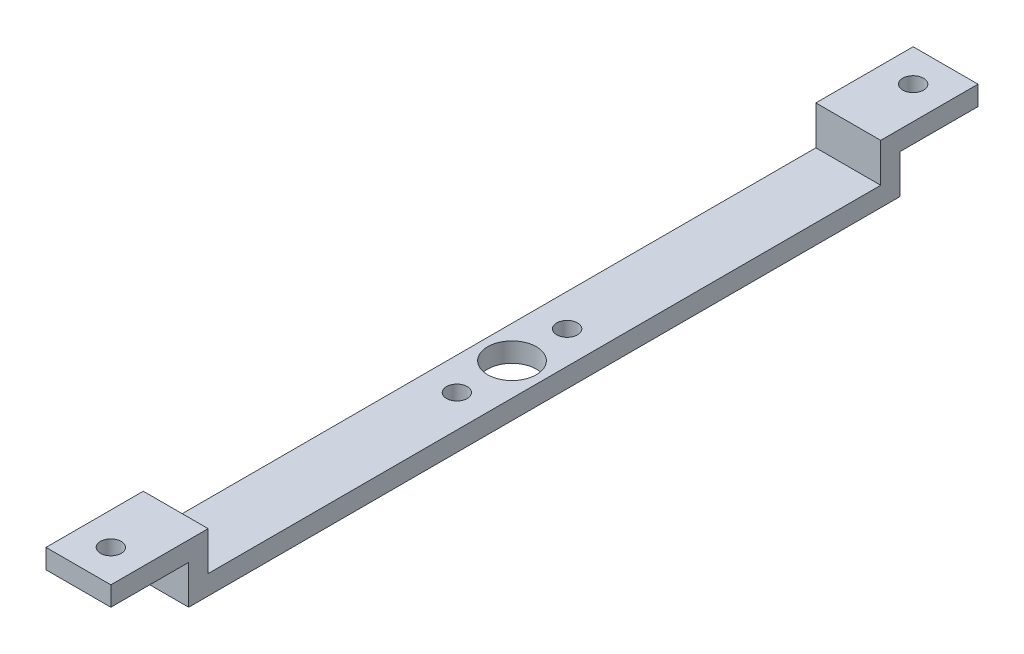
ISO-10303-21;
HEADER;
FILE_DESCRIPTION(('STEP AP214'),'2;1');
FILE_NAME('part.step','',(''),(''),'','','');
FILE_SCHEMA(('AUTOMOTIVE_DESIGN { 1 0 10303 214 1 1 1 1 }'));
ENDSEC;
DATA;
#1=APPLICATION_CONTEXT('core data for automotive mechanical design processes');
#2=APPLICATION_PROTOCOL_DEFINITION('international standard','automotive_design',2000,#1);
#3=PRODUCT_CONTEXT('',#1,'mechanical');
#4=PRODUCT('Part','Part','',(#3));
#5=PRODUCT_RELATED_PRODUCT_CATEGORY('part','',(#4));
#6=PRODUCT_DEFINITION_FORMATION('','',#4);
#7=PRODUCT_DEFINITION_CONTEXT('part definition',#1,'design');
#8=PRODUCT_DEFINITION('design','',#6,#7);
#9=PRODUCT_DEFINITION_SHAPE('','',#8);
#10=(LENGTH_UNIT() NAMED_UNIT(*) SI_UNIT(.MILLI.,.METRE.));
#11=(NAMED_UNIT(*) PLANE_ANGLE_UNIT() SI_UNIT($,.RADIAN.));
#12=(NAMED_UNIT(*) SI_UNIT($,.STERADIAN.) SOLID_ANGLE_UNIT());
#13=UNCERTAINTY_MEASURE_WITH_UNIT(LENGTH_MEASURE(1.E-05),#10,'distance_accuracy_value','');
#14=(GEOMETRIC_REPRESENTATION_CONTEXT(3) GLOBAL_UNCERTAINTY_ASSIGNED_CONTEXT((#13)) GLOBAL_UNIT_ASSIGNED_CONTEXT((#10,
#11,#12)) REPRESENTATION_CONTEXT('',''));
#15=CARTESIAN_POINT('',(0.,0.,0.));
#16=DIRECTION('',(0.,0.,1.));
#17=DIRECTION('',(1.,0.,0.));
#18=AXIS2_PLACEMENT_3D('',#15,#16,#17);
#19=CARTESIAN_POINT('',(10.,0.,61.85));
#20=DIRECTION('',(0.,-1.,0.));
#21=DIRECTION('',(0.,0.,-1.));
#22=AXIS2_PLACEMENT_3D('',#19,#20,#21);
#23=PLANE('',#22);
#24=CARTESIAN_POINT('',(5.,0.,61.85));
#25=DIRECTION('',(0.,-1.,0.));
#26=DIRECTION('',(0.,0.,-1.));
#27=AXIS2_PLACEMENT_3D('',#24,#25,#26);
#28=CIRCLE('',#27,1.6);
#29=CARTESIAN_POINT('',(5.,0.,60.25));
#30=VERTEX_POINT('',#29);
#31=EDGE_CURVE('E262',#30,#30,#28,.F.);
#32=ORIENTED_EDGE('',*,*,#31,.F.);
#33=EDGE_LOOP('',(#32));
#34=FACE_BOUND('',#33,.T.);
#35=DIRECTION('',(0.,0.,1.));
#36=VECTOR('',#35,1.);
#37=CARTESIAN_POINT('',(0.,0.,61.85));
#38=LINE('',#37,#36);
#39=CARTESIAN_POINT('',(0.,0.,51.85));
#40=VERTEX_POINT('',#39);
#41=CARTESIAN_POINT('',(0.,0.,66.85));
#42=VERTEX_POINT('',#41);
#43=EDGE_CURVE('E112',#40,#42,#38,.T.);
#44=ORIENTED_EDGE('',*,*,#43,.T.);
#45=DIRECTION('',(-1.,0.,0.));
#46=VECTOR('',#45,1.);
#47=CARTESIAN_POINT('',(10.,0.,66.85));
#48=LINE('',#47,#46);
#49=CARTESIAN_POINT('',(10.,0.,66.85));
#50=VERTEX_POINT('',#49);
#51=EDGE_CURVE('E11',#50,#42,#48,.T.);
#52=ORIENTED_EDGE('',*,*,#51,.F.);
#53=DIRECTION('',(0.,0.,1.));
#54=VECTOR('',#53,1.);
#55=CARTESIAN_POINT('',(10.,0.,61.85));
#56=LINE('',#55,#54);
#57=CARTESIAN_POINT('',(10.,0.,51.85));
#58=VERTEX_POINT('',#57);
#59=EDGE_CURVE('E118',#58,#50,#56,.T.);
#60=ORIENTED_EDGE('',*,*,#59,.F.);
#61=DIRECTION('',(-1.,0.,0.));
#62=VECTOR('',#61,1.);
#63=CARTESIAN_POINT('',(10.,0.,51.85));
#64=LINE('',#63,#62);
#65=EDGE_CURVE('E168',#58,#40,#64,.T.);
#66=ORIENTED_EDGE('',*,*,#65,.T.);
#67=EDGE_LOOP('',(#44,#52,#60,#66));
#68=FACE_BOUND('',#67,.T.);
#69=ADVANCED_FACE('F45',(#34,#68),#23,.F.);
#70=CARTESIAN_POINT('',(10.,0.,66.85));
#71=DIRECTION('',(0.,0.,-1.));
#72=DIRECTION('',(-1.,0.,0.));
#73=AXIS2_PLACEMENT_3D('',#70,#71,#72);
#74=PLANE('',#73);
#75=DIRECTION('',(0.,-1.,0.));
#76=VECTOR('',#75,1.);
#77=CARTESIAN_POINT('',(0.,0.,66.85));
#78=LINE('',#77,#76);
#79=CARTESIAN_POINT('',(0.,-3.,66.85));
#80=VERTEX_POINT('',#79);
#81=EDGE_CURVE('E174',#42,#80,#78,.T.);
#82=ORIENTED_EDGE('',*,*,#81,.T.);
#83=DIRECTION('',(-1.,0.,0.));
#84=VECTOR('',#83,1.);
#85=CARTESIAN_POINT('',(10.,-3.,66.85));
#86=LINE('',#85,#84);
#87=CARTESIAN_POINT('',(10.,-3.,66.85));
#88=VERTEX_POINT('',#87);
#89=EDGE_CURVE('E55',#88,#80,#86,.T.);
#90=ORIENTED_EDGE('',*,*,#89,.F.);
#91=DIRECTION('',(0.,-1.,0.));
#92=VECTOR('',#91,1.);
#93=CARTESIAN_POINT('',(10.,0.,66.85));
#94=LINE('',#93,#92);
#95=EDGE_CURVE('E283',#50,#88,#94,.T.);
#96=ORIENTED_EDGE('',*,*,#95,.F.);
#97=ORIENTED_EDGE('',*,*,#51,.T.);
#98=EDGE_LOOP('',(#82,#90,#96,#97));
#99=FACE_BOUND('',#98,.T.);
#100=ADVANCED_FACE('F315',(#99),#74,.F.);
#101=CARTESIAN_POINT('',(10.,-3.,66.85));
#102=DIRECTION('',(0.,1.,0.));
#103=DIRECTION('',(0.,0.,1.));
#104=AXIS2_PLACEMENT_3D('',#101,#102,#103);
#105=PLANE('',#104);
#106=CARTESIAN_POINT('',(5.,-3.,61.85));
#107=DIRECTION('',(0.,1.,0.));
#108=DIRECTION('',(0.,0.,1.));
#109=AXIS2_PLACEMENT_3D('',#106,#107,#108);
#110=CIRCLE('',#109,1.6);
#111=CARTESIAN_POINT('',(5.,-3.,63.45));
#112=VERTEX_POINT('',#111);
#113=EDGE_CURVE('E48',#112,#112,#110,.F.);
#114=ORIENTED_EDGE('',*,*,#113,.F.);
#115=EDGE_LOOP('',(#114));
#116=FACE_BOUND('',#115,.T.);
#117=DIRECTION('',(0.,0.,-1.));
#118=VECTOR('',#117,1.);
#119=CARTESIAN_POINT('',(0.,-3.,66.85));
#120=LINE('',#119,#118);
#121=CARTESIAN_POINT('',(0.,-3.,54.85));
#122=VERTEX_POINT('',#121);
#123=EDGE_CURVE('E178',#80,#122,#120,.T.);
#124=ORIENTED_EDGE('',*,*,#123,.T.);
#125=DIRECTION('',(-1.,0.,0.));
#126=VECTOR('',#125,1.);
#127=CARTESIAN_POINT('',(10.,-3.,54.85));
#128=LINE('',#127,#126);
#129=CARTESIAN_POINT('',(10.,-3.,54.85));
#130=VERTEX_POINT('',#129);
#131=EDGE_CURVE('E236',#130,#122,#128,.T.);
#132=ORIENTED_EDGE('',*,*,#131,.F.);
#133=DIRECTION('',(0.,0.,-1.));
#134=VECTOR('',#133,1.);
#135=CARTESIAN_POINT('',(10.,-3.,66.85));
#136=LINE('',#135,#134);
#137=EDGE_CURVE('E286',#88,#130,#136,.T.);
#138=ORIENTED_EDGE('',*,*,#137,.F.);
#139=ORIENTED_EDGE('',*,*,#89,.T.);
#140=EDGE_LOOP('',(#124,#132,#138,#139));
#141=FACE_BOUND('',#140,.T.);
#142=ADVANCED_FACE('F311',(#116,#141),#105,.F.);
#143=CARTESIAN_POINT('',(10.,-6.00000000000001,54.85));
#144=DIRECTION('',(0.,0.,-1.));
#145=DIRECTION('',(-1.,0.,0.));
#146=AXIS2_PLACEMENT_3D('',#143,#144,#145);
#147=PLANE('',#146);
#148=DIRECTION('',(0.,-1.,0.));
#149=VECTOR('',#148,1.);
#150=CARTESIAN_POINT('',(0.,-6.00000000000001,54.85));
#151=LINE('',#150,#149);
#152=CARTESIAN_POINT('',(0.,-9.00000000000001,54.85));
#153=VERTEX_POINT('',#152);
#154=EDGE_CURVE('E182',#122,#153,#151,.T.);
#155=ORIENTED_EDGE('',*,*,#154,.T.);
#156=DIRECTION('',(-1.,0.,0.));
#157=VECTOR('',#156,1.);
#158=CARTESIAN_POINT('',(10.,-9.00000000000001,54.85));
#159=LINE('',#158,#157);
#160=CARTESIAN_POINT('',(10.,-9.00000000000001,54.85));
#161=VERTEX_POINT('',#160);
#162=EDGE_CURVE('E232',#161,#153,#159,.T.);
#163=ORIENTED_EDGE('',*,*,#162,.F.);
#164=DIRECTION('',(0.,-1.,0.));
#165=VECTOR('',#164,1.);
#166=CARTESIAN_POINT('',(10.,-3.,54.85));
#167=LINE('',#166,#165);
#168=EDGE_CURVE('E289',#130,#161,#167,.T.);
#169=ORIENTED_EDGE('',*,*,#168,.F.);
#170=ORIENTED_EDGE('',*,*,#131,.T.);
#171=EDGE_LOOP('',(#155,#163,#169,#170));
#172=FACE_BOUND('',#171,.T.);
#173=ADVANCED_FACE('F314',(#172),#147,.F.);
#174=CARTESIAN_POINT('',(10.,-9.00000000000001,54.85));
#175=DIRECTION('',(0.,1.,0.));
#176=DIRECTION('',(0.,0.,1.));
#177=AXIS2_PLACEMENT_3D('',#174,#175,#176);
#178=PLANE('',#177);
#179=CARTESIAN_POINT('',(5.00000000000001,-9.00000000000001,0.));
#180=DIRECTION('',(0.,1.,0.));
#181=DIRECTION('',(0.,0.,1.));
#182=AXIS2_PLACEMENT_3D('',#179,#180,#181);
#183=CIRCLE('',#182,3.75);
#184=CARTESIAN_POINT('',(5.00000000000001,-9.00000000000001,3.75));
#185=VERTEX_POINT('',#184);
#186=EDGE_CURVE('E246',#185,#185,#183,.T.);
#187=ORIENTED_EDGE('',*,*,#186,.T.);
#188=EDGE_LOOP('',(#187));
#189=FACE_BOUND('',#188,.T.);
#190=CARTESIAN_POINT('',(5.00000000000001,-9.00000000000001,-8.5));
#191=DIRECTION('',(0.,1.,0.));
#192=DIRECTION('',(0.,0.,1.));
#193=AXIS2_PLACEMENT_3D('',#190,#191,#192);
#194=CIRCLE('',#193,1.6);
#195=CARTESIAN_POINT('',(5.00000000000001,-9.00000000000001,-6.9));
#196=VERTEX_POINT('',#195);
#197=EDGE_CURVE('E175',#196,#196,#194,.T.);
#198=ORIENTED_EDGE('',*,*,#197,.T.);
#199=EDGE_LOOP('',(#198));
#200=FACE_BOUND('',#199,.T.);
#201=CARTESIAN_POINT('',(5.00000000000001,-9.00000000000001,8.5));
#202=DIRECTION('',(0.,1.,0.));
#203=DIRECTION('',(0.,0.,1.));
#204=AXIS2_PLACEMENT_3D('',#201,#202,#203);
#205=CIRCLE('',#204,1.6);
#206=CARTESIAN_POINT('',(5.00000000000001,-9.00000000000001,10.1));
#207=VERTEX_POINT('',#206);
#208=EDGE_CURVE('E274',#207,#207,#205,.T.);
#209=ORIENTED_EDGE('',*,*,#208,.T.);
#210=EDGE_LOOP('',(#209));
#211=FACE_BOUND('',#210,.T.);
#212=DIRECTION('',(0.,0.,-1.));
#213=VECTOR('',#212,1.);
#214=CARTESIAN_POINT('',(0.,-9.00000000000001,54.85));
#215=LINE('',#214,#213);
#216=CARTESIAN_POINT('',(0.,-9.00000000000001,-54.85));
#217=VERTEX_POINT('',#216);
#218=EDGE_CURVE('E185',#153,#217,#215,.T.);
#219=ORIENTED_EDGE('',*,*,#218,.T.);
#220=DIRECTION('',(-1.,0.,0.));
#221=VECTOR('',#220,1.);
#222=CARTESIAN_POINT('',(10.,-9.00000000000001,-54.85));
#223=LINE('',#222,#221);
#224=CARTESIAN_POINT('',(10.,-9.00000000000001,-54.85));
#225=VERTEX_POINT('',#224);
#226=EDGE_CURVE('E228',#225,#217,#223,.T.);
#227=ORIENTED_EDGE('',*,*,#226,.F.);
#228=DIRECTION('',(0.,0.,-1.));
#229=VECTOR('',#228,1.);
#230=CARTESIAN_POINT('',(10.,-9.00000000000001,54.85));
#231=LINE('',#230,#229);
#232=EDGE_CURVE('E292',#161,#225,#231,.T.);
#233=ORIENTED_EDGE('',*,*,#232,.F.);
#234=ORIENTED_EDGE('',*,*,#162,.T.);
#235=EDGE_LOOP('',(#219,#227,#233,#234));
#236=FACE_BOUND('',#235,.T.);
#237=ADVANCED_FACE('F379',(#189,#200,#211,#236),#178,.F.);
#238=CARTESIAN_POINT('',(10.,-3.,-54.85));
#239=DIRECTION('',(0.,0.,1.));
#240=DIRECTION('',(1.,0.,0.));
#241=AXIS2_PLACEMENT_3D('',#238,#239,#240);
#242=PLANE('',#241);
#243=DIRECTION('',(0.,1.,0.));
#244=VECTOR('',#243,1.);
#245=CARTESIAN_POINT('',(0.,-3.,-54.85));
#246=LINE('',#245,#244);
#247=CARTESIAN_POINT('',(0.,-3.,-54.85));
#248=VERTEX_POINT('',#247);
#249=EDGE_CURVE('E189',#217,#248,#246,.T.);
#250=ORIENTED_EDGE('',*,*,#249,.T.);
#251=DIRECTION('',(-1.,0.,0.));
#252=VECTOR('',#251,1.);
#253=CARTESIAN_POINT('',(10.,-3.,-54.85));
#254=LINE('',#253,#252);
#255=CARTESIAN_POINT('',(10.,-3.,-54.85));
#256=VERTEX_POINT('',#255);
#257=EDGE_CURVE('E224',#256,#248,#254,.T.);
#258=ORIENTED_EDGE('',*,*,#257,.F.);
#259=DIRECTION('',(0.,1.,0.));
#260=VECTOR('',#259,1.);
#261=CARTESIAN_POINT('',(10.,-6.00000000000001,-54.85));
#262=LINE('',#261,#260);
#263=EDGE_CURVE('E295',#225,#256,#262,.T.);
#264=ORIENTED_EDGE('',*,*,#263,.F.);
#265=ORIENTED_EDGE('',*,*,#226,.T.);
#266=EDGE_LOOP('',(#250,#258,#264,#265));
#267=FACE_BOUND('',#266,.T.);
#268=ADVANCED_FACE('F375',(#267),#242,.F.);
#269=CARTESIAN_POINT('',(10.,-3.,-66.85));
#270=DIRECTION('',(0.,1.,0.));
#271=DIRECTION('',(0.,0.,1.));
#272=AXIS2_PLACEMENT_3D('',#269,#270,#271);
#273=PLANE('',#272);
#274=CARTESIAN_POINT('',(5.,-3.,-61.85));
#275=DIRECTION('',(0.,1.,0.));
#276=DIRECTION('',(0.,0.,1.));
#277=AXIS2_PLACEMENT_3D('',#274,#275,#276);
#278=CIRCLE('',#277,1.6);
#279=CARTESIAN_POINT('',(5.,-3.,-60.25));
#280=VERTEX_POINT('',#279);
#281=EDGE_CURVE('E245',#280,#280,#278,.F.);
#282=ORIENTED_EDGE('',*,*,#281,.F.);
#283=EDGE_LOOP('',(#282));
#284=FACE_BOUND('',#283,.T.);
#285=DIRECTION('',(0.,0.,-1.));
#286=VECTOR('',#285,1.);
#287=CARTESIAN_POINT('',(0.,-3.,-66.85));
#288=LINE('',#287,#286);
#289=CARTESIAN_POINT('',(0.,-3.,-66.85));
#290=VERTEX_POINT('',#289);
#291=EDGE_CURVE('E192',#248,#290,#288,.T.);
#292=ORIENTED_EDGE('',*,*,#291,.T.);
#293=DIRECTION('',(-1.,0.,0.));
#294=VECTOR('',#293,1.);
#295=CARTESIAN_POINT('',(10.,-3.,-66.85));
#296=LINE('',#295,#294);
#297=CARTESIAN_POINT('',(10.,-3.,-66.85));
#298=VERTEX_POINT('',#297);
#299=EDGE_CURVE('E220',#298,#290,#296,.T.);
#300=ORIENTED_EDGE('',*,*,#299,.F.);
#301=DIRECTION('',(0.,0.,-1.));
#302=VECTOR('',#301,1.);
#303=CARTESIAN_POINT('',(10.,-3.,-66.85));
#304=LINE('',#303,#302);
#305=EDGE_CURVE('E298',#256,#298,#304,.T.);
#306=ORIENTED_EDGE('',*,*,#305,.F.);
#307=ORIENTED_EDGE('',*,*,#257,.T.);
#308=EDGE_LOOP('',(#292,#300,#306,#307));
#309=FACE_BOUND('',#308,.T.);
#310=ADVANCED_FACE('F370',(#284,#309),#273,.F.);
#311=CARTESIAN_POINT('',(10.,0.,-66.85));
#312=DIRECTION('',(0.,0.,1.));
#313=DIRECTION('',(1.,0.,0.));
#314=AXIS2_PLACEMENT_3D('',#311,#312,#313);
#315=PLANE('',#314);
#316=DIRECTION('',(0.,1.,0.));
#317=VECTOR('',#316,1.);
#318=CARTESIAN_POINT('',(0.,0.,-66.85));
#319=LINE('',#318,#317);
#320=CARTESIAN_POINT('',(0.,0.,-66.85));
#321=VERTEX_POINT('',#320);
#322=EDGE_CURVE('E195',#290,#321,#319,.T.);
#323=ORIENTED_EDGE('',*,*,#322,.T.);
#324=DIRECTION('',(-1.,0.,0.));
#325=VECTOR('',#324,1.);
#326=CARTESIAN_POINT('',(10.,0.,-66.85));
#327=LINE('',#326,#325);
#328=CARTESIAN_POINT('',(10.,0.,-66.85));
#329=VERTEX_POINT('',#328);
#330=EDGE_CURVE('E216',#329,#321,#327,.T.);
#331=ORIENTED_EDGE('',*,*,#330,.F.);
#332=DIRECTION('',(0.,1.,0.));
#333=VECTOR('',#332,1.);
#334=CARTESIAN_POINT('',(10.,0.,-66.85));
#335=LINE('',#334,#333);
#336=EDGE_CURVE('E301',#298,#329,#335,.T.);
#337=ORIENTED_EDGE('',*,*,#336,.F.);
#338=ORIENTED_EDGE('',*,*,#299,.T.);
#339=EDGE_LOOP('',(#323,#331,#337,#338));
#340=FACE_BOUND('',#339,.T.);
#341=ADVANCED_FACE('F356',(#340),#315,.F.);
#342=CARTESIAN_POINT('',(10.,0.,-61.85));
#343=DIRECTION('',(0.,-1.,0.));
#344=DIRECTION('',(0.,0.,-1.));
#345=AXIS2_PLACEMENT_3D('',#342,#343,#344);
#346=PLANE('',#345);
#347=CARTESIAN_POINT('',(5.,0.,-61.85));
#348=DIRECTION('',(0.,-1.,0.));
#349=DIRECTION('',(0.,0.,-1.));
#350=AXIS2_PLACEMENT_3D('',#347,#348,#349);
#351=CIRCLE('',#350,1.6);
#352=CARTESIAN_POINT('',(5.,0.,-63.45));
#353=VERTEX_POINT('',#352);
#354=EDGE_CURVE('E242',#353,#353,#351,.F.);
#355=ORIENTED_EDGE('',*,*,#354,.F.);
#356=EDGE_LOOP('',(#355));
#357=FACE_BOUND('',#356,.T.);
#358=DIRECTION('',(0.,0.,1.));
#359=VECTOR('',#358,1.);
#360=CARTESIAN_POINT('',(0.,0.,-61.85));
#361=LINE('',#360,#359);
#362=CARTESIAN_POINT('',(0.,0.,-51.85));
#363=VERTEX_POINT('',#362);
#364=EDGE_CURVE('E199',#321,#363,#361,.T.);
#365=ORIENTED_EDGE('',*,*,#364,.T.);
#366=DIRECTION('',(-1.,0.,0.));
#367=VECTOR('',#366,1.);
#368=CARTESIAN_POINT('',(10.,0.,-51.85));
#369=LINE('',#368,#367);
#370=CARTESIAN_POINT('',(10.,0.,-51.85));
#371=VERTEX_POINT('',#370);
#372=EDGE_CURVE('E161',#371,#363,#369,.T.);
#373=ORIENTED_EDGE('',*,*,#372,.F.);
#374=DIRECTION('',(0.,0.,1.));
#375=VECTOR('',#374,1.);
#376=CARTESIAN_POINT('',(10.,0.,-61.85));
#377=LINE('',#376,#375);
#378=EDGE_CURVE('E150',#329,#371,#377,.T.);
#379=ORIENTED_EDGE('',*,*,#378,.F.);
#380=ORIENTED_EDGE('',*,*,#330,.T.);
#381=EDGE_LOOP('',(#365,#373,#379,#380));
#382=FACE_BOUND('',#381,.T.);
#383=ADVANCED_FACE('F359',(#357,#382),#346,.F.);
#384=CARTESIAN_POINT('',(10.,0.,-51.85));
#385=DIRECTION('',(0.,0.,-1.));
#386=DIRECTION('',(-1.,0.,0.));
#387=AXIS2_PLACEMENT_3D('',#384,#385,#386);
#388=PLANE('',#387);
#389=DIRECTION('',(0.,-1.,0.));
#390=VECTOR('',#389,1.);
#391=CARTESIAN_POINT('',(0.,0.,-51.85));
#392=LINE('',#391,#390);
#393=CARTESIAN_POINT('',(0.,-6.00000000000001,-51.85));
#394=VERTEX_POINT('',#393);
#395=EDGE_CURVE('E159',#363,#394,#392,.T.);
#396=ORIENTED_EDGE('',*,*,#395,.T.);
#397=DIRECTION('',(-1.,0.,0.));
#398=VECTOR('',#397,1.);
#399=CARTESIAN_POINT('',(10.,-6.00000000000001,-51.85));
#400=LINE('',#399,#398);
#401=CARTESIAN_POINT('',(10.,-6.00000000000001,-51.85));
#402=VERTEX_POINT('',#401);
#403=EDGE_CURVE('E156',#402,#394,#400,.T.);
#404=ORIENTED_EDGE('',*,*,#403,.F.);
#405=DIRECTION('',(0.,-1.,0.));
#406=VECTOR('',#405,1.);
#407=CARTESIAN_POINT('',(10.,0.,-51.85));
#408=LINE('',#407,#406);
#409=EDGE_CURVE('E144',#371,#402,#408,.T.);
#410=ORIENTED_EDGE('',*,*,#409,.F.);
#411=ORIENTED_EDGE('',*,*,#372,.T.);
#412=EDGE_LOOP('',(#396,#404,#410,#411));
#413=FACE_BOUND('',#412,.T.);
#414=ADVANCED_FACE('F157',(#413),#388,.F.);
#415=CARTESIAN_POINT('',(10.,-6.00000000000001,51.85));
#416=DIRECTION('',(0.,-1.,0.));
#417=DIRECTION('',(0.,0.,-1.));
#418=AXIS2_PLACEMENT_3D('',#415,#416,#417);
#419=PLANE('',#418);
#420=CARTESIAN_POINT('',(5.00000000000001,-6.00000000000001,0.));
#421=DIRECTION('',(0.,1.,0.));
#422=DIRECTION('',(0.,0.,1.));
#423=AXIS2_PLACEMENT_3D('',#420,#421,#422);
#424=CIRCLE('',#423,3.75);
#425=CARTESIAN_POINT('',(5.00000000000001,-6.00000000000001,3.75));
#426=VERTEX_POINT('',#425);
#427=EDGE_CURVE('E254',#426,#426,#424,.T.);
#428=ORIENTED_EDGE('',*,*,#427,.F.);
#429=EDGE_LOOP('',(#428));
#430=FACE_BOUND('',#429,.T.);
#431=CARTESIAN_POINT('',(5.00000000000001,-6.00000000000001,-8.5));
#432=DIRECTION('',(0.,1.,0.));
#433=DIRECTION('',(0.,0.,-1.));
#434=AXIS2_PLACEMENT_3D('',#431,#432,#433);
#435=CIRCLE('',#434,1.6);
#436=CARTESIAN_POINT('',(5.00000000000001,-6.00000000000001,-10.1));
#437=VERTEX_POINT('',#436);
#438=EDGE_CURVE('E266',#437,#437,#435,.T.);
#439=ORIENTED_EDGE('',*,*,#438,.F.);
#440=EDGE_LOOP('',(#439));
#441=FACE_BOUND('',#440,.T.);
#442=CARTESIAN_POINT('',(5.00000000000001,-6.00000000000001,8.5));
#443=DIRECTION('',(0.,1.,0.));
#444=DIRECTION('',(0.,0.,1.));
#445=AXIS2_PLACEMENT_3D('',#442,#443,#444);
#446=CIRCLE('',#445,1.6);
#447=CARTESIAN_POINT('',(5.00000000000001,-6.00000000000001,10.1));
#448=VERTEX_POINT('',#447);
#449=EDGE_CURVE('E270',#448,#448,#446,.T.);
#450=ORIENTED_EDGE('',*,*,#449,.F.);
#451=EDGE_LOOP('',(#450));
#452=FACE_BOUND('',#451,.T.);
#453=DIRECTION('',(0.,0.,1.));
#454=VECTOR('',#453,1.);
#455=CARTESIAN_POINT('',(0.,-6.00000000000001,51.85));
#456=LINE('',#455,#454);
#457=CARTESIAN_POINT('',(0.,-6.00000000000001,51.85));
#458=VERTEX_POINT('',#457);
#459=EDGE_CURVE('E105',#394,#458,#456,.T.);
#460=ORIENTED_EDGE('',*,*,#459,.T.);
#461=DIRECTION('',(-1.,0.,0.));
#462=VECTOR('',#461,1.);
#463=CARTESIAN_POINT('',(10.,-6.00000000000001,51.85));
#464=LINE('',#463,#462);
#465=CARTESIAN_POINT('',(10.,-6.00000000000001,51.85));
#466=VERTEX_POINT('',#465);
#467=EDGE_CURVE('E162',#466,#458,#464,.T.);
#468=ORIENTED_EDGE('',*,*,#467,.F.);
#469=DIRECTION('',(0.,0.,1.));
#470=VECTOR('',#469,1.);
#471=CARTESIAN_POINT('',(10.,-6.00000000000001,51.85));
#472=LINE('',#471,#470);
#473=EDGE_CURVE('E148',#402,#466,#472,.T.);
#474=ORIENTED_EDGE('',*,*,#473,.F.);
#475=ORIENTED_EDGE('',*,*,#403,.T.);
#476=EDGE_LOOP('',(#460,#468,#474,#475));
#477=FACE_BOUND('',#476,.T.);
#478=ADVANCED_FACE('F164',(#430,#441,#452,#477),#419,.F.);
#479=CARTESIAN_POINT('',(10.,0.,51.85));
#480=DIRECTION('',(0.,0.,1.));
#481=DIRECTION('',(1.,0.,0.));
#482=AXIS2_PLACEMENT_3D('',#479,#480,#481);
#483=PLANE('',#482);
#484=DIRECTION('',(0.,1.,0.));
#485=VECTOR('',#484,1.);
#486=CARTESIAN_POINT('',(0.,0.,51.85));
#487=LINE('',#486,#485);
#488=EDGE_CURVE('E206',#458,#40,#487,.T.);
#489=ORIENTED_EDGE('',*,*,#488,.T.);
#490=ORIENTED_EDGE('',*,*,#65,.F.);
#491=DIRECTION('',(0.,1.,0.));
#492=VECTOR('',#491,1.);
#493=CARTESIAN_POINT('',(10.,0.,51.85));
#494=LINE('',#493,#492);
#495=EDGE_CURVE('E64',#466,#58,#494,.T.);
#496=ORIENTED_EDGE('',*,*,#495,.F.);
#497=ORIENTED_EDGE('',*,*,#467,.T.);
#498=EDGE_LOOP('',(#489,#490,#496,#497));
#499=FACE_BOUND('',#498,.T.);
#500=ADVANCED_FACE('F339',(#499),#483,.F.);
#501=CARTESIAN_POINT('',(10.,0.,0.));
#502=DIRECTION('',(-1.,0.,0.));
#503=DIRECTION('',(0.,0.,1.));
#504=AXIS2_PLACEMENT_3D('',#501,#502,#503);
#505=PLANE('',#504);
#506=ORIENTED_EDGE('',*,*,#59,.T.);
#507=ORIENTED_EDGE('',*,*,#95,.T.);
#508=ORIENTED_EDGE('',*,*,#137,.T.);
#509=ORIENTED_EDGE('',*,*,#168,.T.);
#510=ORIENTED_EDGE('',*,*,#232,.T.);
#511=ORIENTED_EDGE('',*,*,#263,.T.);
#512=ORIENTED_EDGE('',*,*,#305,.T.);
#513=ORIENTED_EDGE('',*,*,#336,.T.);
#514=ORIENTED_EDGE('',*,*,#378,.T.);
#515=ORIENTED_EDGE('',*,*,#409,.T.);
#516=ORIENTED_EDGE('',*,*,#473,.T.);
#517=ORIENTED_EDGE('',*,*,#495,.T.);
#518=EDGE_LOOP('',(#506,#507,#508,#509,#510,#511,#512,#513,#514,#515,#516,#517));
#519=FACE_BOUND('',#518,.T.);
#520=ADVANCED_FACE('F146',(#519),#505,.F.);
#521=CARTESIAN_POINT('',(0.,0.,0.));
#522=DIRECTION('',(-1.,0.,0.));
#523=DIRECTION('',(0.,0.,1.));
#524=AXIS2_PLACEMENT_3D('',#521,#522,#523);
#525=PLANE('',#524);
#526=ORIENTED_EDGE('',*,*,#43,.F.);
#527=ORIENTED_EDGE('',*,*,#488,.F.);
#528=ORIENTED_EDGE('',*,*,#459,.F.);
#529=ORIENTED_EDGE('',*,*,#395,.F.);
#530=ORIENTED_EDGE('',*,*,#364,.F.);
#531=ORIENTED_EDGE('',*,*,#322,.F.);
#532=ORIENTED_EDGE('',*,*,#291,.F.);
#533=ORIENTED_EDGE('',*,*,#249,.F.);
#534=ORIENTED_EDGE('',*,*,#218,.F.);
#535=ORIENTED_EDGE('',*,*,#154,.F.);
#536=ORIENTED_EDGE('',*,*,#123,.F.);
#537=ORIENTED_EDGE('',*,*,#81,.F.);
#538=EDGE_LOOP('',(#526,#527,#528,#529,#530,#531,#532,#533,#534,#535,#536,#537));
#539=FACE_BOUND('',#538,.T.);
#540=ADVANCED_FACE('F328',(#539),#525,.T.);
#541=CARTESIAN_POINT('',(5.00000000000001,-16.,8.5));
#542=DIRECTION('',(0.,1.,0.));
#543=DIRECTION('',(0.,0.,1.));
#544=AXIS2_PLACEMENT_3D('',#541,#542,#543);
#545=CYLINDRICAL_SURFACE('',#544,1.6);
#546=ORIENTED_EDGE('',*,*,#449,.T.);
#547=EDGE_LOOP('',(#546));
#548=FACE_BOUND('',#547,.T.);
#549=ORIENTED_EDGE('',*,*,#208,.F.);
#550=EDGE_LOOP('',(#549));
#551=FACE_BOUND('',#550,.T.);
#552=ADVANCED_FACE('F330',(#548,#551),#545,.F.);
#553=CARTESIAN_POINT('',(5.00000000000001,-16.,-8.5));
#554=DIRECTION('',(0.,1.,0.));
#555=DIRECTION('',(0.,0.,1.));
#556=AXIS2_PLACEMENT_3D('',#553,#554,#555);
#557=CYLINDRICAL_SURFACE('',#556,1.6);
#558=ORIENTED_EDGE('',*,*,#438,.T.);
#559=EDGE_LOOP('',(#558));
#560=FACE_BOUND('',#559,.T.);
#561=ORIENTED_EDGE('',*,*,#197,.F.);
#562=EDGE_LOOP('',(#561));
#563=FACE_BOUND('',#562,.T.);
#564=ADVANCED_FACE('F336',(#560,#563),#557,.F.);
#565=CARTESIAN_POINT('',(5.,3.99999999999999,-61.85));
#566=DIRECTION('',(0.,-1.,0.));
#567=DIRECTION('',(0.,0.,-1.));
#568=AXIS2_PLACEMENT_3D('',#565,#566,#567);
#569=CYLINDRICAL_SURFACE('',#568,1.6);
#570=ORIENTED_EDGE('',*,*,#354,.T.);
#571=EDGE_LOOP('',(#570));
#572=FACE_BOUND('',#571,.T.);
#573=ORIENTED_EDGE('',*,*,#281,.T.);
#574=EDGE_LOOP('',(#573));
#575=FACE_BOUND('',#574,.T.);
#576=ADVANCED_FACE('F437',(#572,#575),#569,.F.);
#577=CARTESIAN_POINT('',(5.,3.99999999999999,61.85));
#578=DIRECTION('',(0.,-1.,0.));
#579=DIRECTION('',(0.,0.,-1.));
#580=AXIS2_PLACEMENT_3D('',#577,#578,#579);
#581=CYLINDRICAL_SURFACE('',#580,1.6);
#582=ORIENTED_EDGE('',*,*,#113,.T.);
#583=EDGE_LOOP('',(#582));
#584=FACE_BOUND('',#583,.T.);
#585=ORIENTED_EDGE('',*,*,#31,.T.);
#586=EDGE_LOOP('',(#585));
#587=FACE_BOUND('',#586,.T.);
#588=ADVANCED_FACE('F308',(#584,#587),#581,.F.);
#589=CARTESIAN_POINT('',(5.00000000000001,-16.,0.));
#590=DIRECTION('',(0.,1.,0.));
#591=DIRECTION('',(0.,0.,1.));
#592=AXIS2_PLACEMENT_3D('',#589,#590,#591);
#593=CYLINDRICAL_SURFACE('',#592,3.75);
#594=ORIENTED_EDGE('',*,*,#427,.T.);
#595=EDGE_LOOP('',(#594));
#596=FACE_BOUND('',#595,.T.);
#597=ORIENTED_EDGE('',*,*,#186,.F.);
#598=EDGE_LOOP('',(#597));
#599=FACE_BOUND('',#598,.T.);
#600=ADVANCED_FACE('F454',(#596,#599),#593,.F.);
#601=CLOSED_SHELL('',(#69,#100,#142,#173,#237,#268,#310,#341,#383,#414,#478,#500,#520,#540,#552,
#564,#576,#588,#600));
#602=MANIFOLD_SOLID_BREP('B2',#601);
#603=ADVANCED_BREP_SHAPE_REPRESENTATION('',(#18,#602),#14);
#604=SHAPE_DEFINITION_REPRESENTATION(#9,#603);
ENDSEC;
END-ISO-10303-21;
